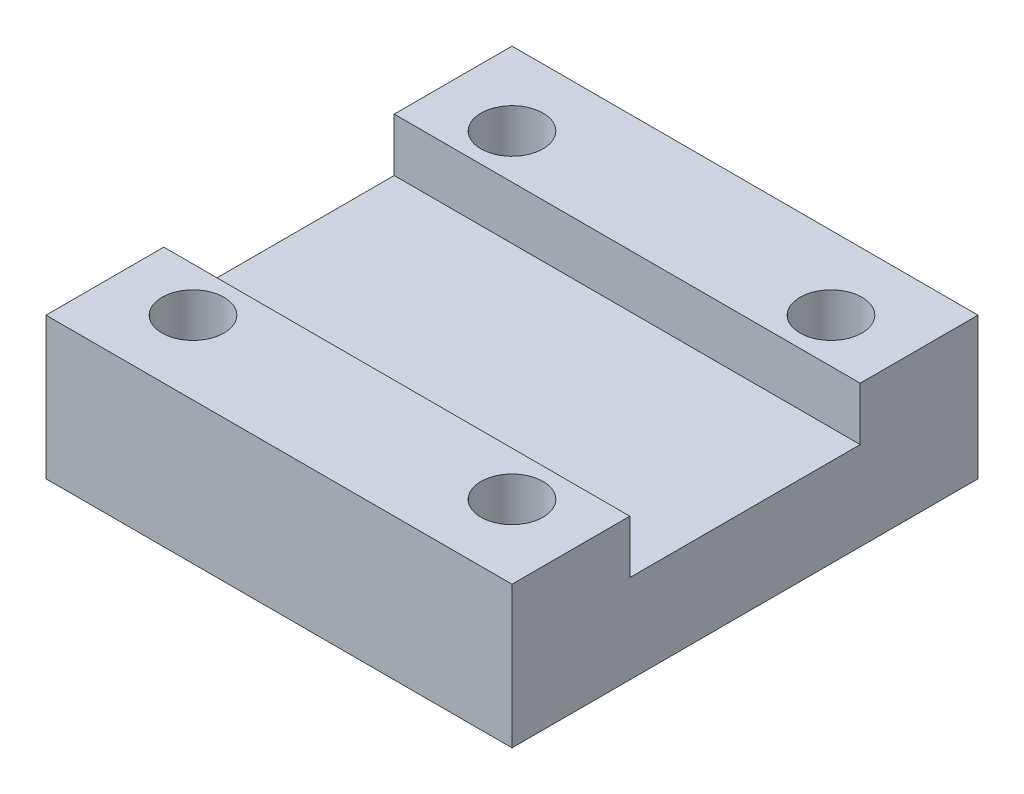
ISO-10303-21;
HEADER;
FILE_DESCRIPTION(('STEP AP214'),'2;1');
FILE_NAME('part.step','',(''),(''),'','','');
FILE_SCHEMA(('AUTOMOTIVE_DESIGN { 1 0 10303 214 1 1 1 1 }'));
ENDSEC;
DATA;
#1=APPLICATION_CONTEXT('core data for automotive mechanical design processes');
#2=APPLICATION_PROTOCOL_DEFINITION('international standard','automotive_design',2000,#1);
#3=PRODUCT_CONTEXT('',#1,'mechanical');
#4=PRODUCT('Part','Part','',(#3));
#5=PRODUCT_RELATED_PRODUCT_CATEGORY('part','',(#4));
#6=PRODUCT_DEFINITION_FORMATION('','',#4);
#7=PRODUCT_DEFINITION_CONTEXT('part definition',#1,'design');
#8=PRODUCT_DEFINITION('design','',#6,#7);
#9=PRODUCT_DEFINITION_SHAPE('','',#8);
#10=(LENGTH_UNIT() NAMED_UNIT(*) SI_UNIT(.MILLI.,.METRE.));
#11=(NAMED_UNIT(*) PLANE_ANGLE_UNIT() SI_UNIT($,.RADIAN.));
#12=(NAMED_UNIT(*) SI_UNIT($,.STERADIAN.) SOLID_ANGLE_UNIT());
#13=UNCERTAINTY_MEASURE_WITH_UNIT(LENGTH_MEASURE(1.E-05),#10,'distance_accuracy_value','');
#14=(GEOMETRIC_REPRESENTATION_CONTEXT(3) GLOBAL_UNCERTAINTY_ASSIGNED_CONTEXT((#13)) GLOBAL_UNIT_ASSIGNED_CONTEXT((#10,
#11,#12)) REPRESENTATION_CONTEXT('',''));
#15=CARTESIAN_POINT('',(0.,0.,0.));
#16=DIRECTION('',(0.,0.,1.));
#17=DIRECTION('',(1.,0.,0.));
#18=AXIS2_PLACEMENT_3D('',#15,#16,#17);
#19=CARTESIAN_POINT('',(0.,16.,0.));
#20=DIRECTION('',(0.,-1.,0.));
#21=DIRECTION('',(0.,0.,-1.));
#22=AXIS2_PLACEMENT_3D('',#19,#20,#21);
#23=PLANE('',#22);
#24=CARTESIAN_POINT('',(18.,16.,18.));
#25=DIRECTION('',(0.,1.,0.));
#26=DIRECTION('',(0.,0.,1.));
#27=AXIS2_PLACEMENT_3D('',#24,#25,#26);
#28=CIRCLE('',#27,3.5);
#29=CARTESIAN_POINT('',(18.,16.,21.5));
#30=VERTEX_POINT('',#29);
#31=EDGE_CURVE('E226',#30,#30,#28,.T.);
#32=ORIENTED_EDGE('',*,*,#31,.F.);
#33=EDGE_LOOP('',(#32));
#34=FACE_BOUND('',#33,.T.);
#35=CARTESIAN_POINT('',(-18.,16.,18.));
#36=DIRECTION('',(0.,1.,0.));
#37=DIRECTION('',(0.,0.,1.));
#38=AXIS2_PLACEMENT_3D('',#35,#36,#37);
#39=CIRCLE('',#38,3.5);
#40=CARTESIAN_POINT('',(-18.,16.,21.5));
#41=VERTEX_POINT('',#40);
#42=EDGE_CURVE('E222',#41,#41,#39,.T.);
#43=ORIENTED_EDGE('',*,*,#42,.F.);
#44=EDGE_LOOP('',(#43));
#45=FACE_BOUND('',#44,.T.);
#46=DIRECTION('',(0.,0.,-1.));
#47=VECTOR('',#46,1.);
#48=CARTESIAN_POINT('',(26.295,16.,26.295));
#49=LINE('',#48,#47);
#50=CARTESIAN_POINT('',(26.295,16.,26.295));
#51=VERTEX_POINT('',#50);
#52=CARTESIAN_POINT('',(26.295,16.,13.));
#53=VERTEX_POINT('',#52);
#54=EDGE_CURVE('E148',#51,#53,#49,.T.);
#55=ORIENTED_EDGE('',*,*,#54,.T.);
#56=DIRECTION('',(1.,0.,0.));
#57=VECTOR('',#56,1.);
#58=CARTESIAN_POINT('',(-26.295,16.,13.));
#59=LINE('',#58,#57);
#60=CARTESIAN_POINT('',(-26.295,16.,13.));
#61=VERTEX_POINT('',#60);
#62=EDGE_CURVE('E142',#61,#53,#59,.T.);
#63=ORIENTED_EDGE('',*,*,#62,.F.);
#64=DIRECTION('',(0.,0.,1.));
#65=VECTOR('',#64,1.);
#66=CARTESIAN_POINT('',(-26.295,16.,26.295));
#67=LINE('',#66,#65);
#68=CARTESIAN_POINT('',(-26.295,16.,26.295));
#69=VERTEX_POINT('',#68);
#70=EDGE_CURVE('E130',#61,#69,#67,.T.);
#71=ORIENTED_EDGE('',*,*,#70,.T.);
#72=DIRECTION('',(1.,0.,0.));
#73=VECTOR('',#72,1.);
#74=CARTESIAN_POINT('',(-26.295,16.,26.295));
#75=LINE('',#74,#73);
#76=EDGE_CURVE('E56',#69,#51,#75,.T.);
#77=ORIENTED_EDGE('',*,*,#76,.T.);
#78=EDGE_LOOP('',(#55,#63,#71,#77));
#79=FACE_BOUND('',#78,.T.);
#80=ADVANCED_FACE('F32',(#34,#45,#79),#23,.F.);
#81=CARTESIAN_POINT('',(26.295,16.,26.295));
#82=DIRECTION('',(-1.,0.,0.));
#83=DIRECTION('',(0.,0.,1.));
#84=AXIS2_PLACEMENT_3D('',#81,#82,#83);
#85=PLANE('',#84);
#86=DIRECTION('',(0.,0.,-1.));
#87=VECTOR('',#86,1.);
#88=CARTESIAN_POINT('',(26.295,10.,13.));
#89=LINE('',#88,#87);
#90=CARTESIAN_POINT('',(26.295,10.,13.));
#91=VERTEX_POINT('',#90);
#92=CARTESIAN_POINT('',(26.295,10.,-13.));
#93=VERTEX_POINT('',#92);
#94=EDGE_CURVE('E132',#91,#93,#89,.T.);
#95=ORIENTED_EDGE('',*,*,#94,.F.);
#96=DIRECTION('',(0.,-1.,0.));
#97=VECTOR('',#96,1.);
#98=CARTESIAN_POINT('',(26.295,16.,13.));
#99=LINE('',#98,#97);
#100=EDGE_CURVE('E113',#53,#91,#99,.T.);
#101=ORIENTED_EDGE('',*,*,#100,.F.);
#102=ORIENTED_EDGE('',*,*,#54,.F.);
#103=DIRECTION('',(0.,-1.,0.));
#104=VECTOR('',#103,1.);
#105=CARTESIAN_POINT('',(26.295,16.,26.295));
#106=LINE('',#105,#104);
#107=CARTESIAN_POINT('',(26.295,0.,26.295));
#108=VERTEX_POINT('',#107);
#109=EDGE_CURVE('E156',#51,#108,#106,.T.);
#110=ORIENTED_EDGE('',*,*,#109,.T.);
#111=DIRECTION('',(0.,0.,-1.));
#112=VECTOR('',#111,1.);
#113=CARTESIAN_POINT('',(26.295,0.,26.295));
#114=LINE('',#113,#112);
#115=CARTESIAN_POINT('',(26.295,0.,-26.295));
#116=VERTEX_POINT('',#115);
#117=EDGE_CURVE('E144',#108,#116,#114,.T.);
#118=ORIENTED_EDGE('',*,*,#117,.T.);
#119=DIRECTION('',(0.,-1.,0.));
#120=VECTOR('',#119,1.);
#121=CARTESIAN_POINT('',(26.295,16.,-26.295));
#122=LINE('',#121,#120);
#123=CARTESIAN_POINT('',(26.295,16.,-26.295));
#124=VERTEX_POINT('',#123);
#125=EDGE_CURVE('E11',#124,#116,#122,.T.);
#126=ORIENTED_EDGE('',*,*,#125,.F.);
#127=CARTESIAN_POINT('',(26.295,16.,-13.));
#128=VERTEX_POINT('',#127);
#129=EDGE_CURVE('E84',#128,#124,#49,.T.);
#130=ORIENTED_EDGE('',*,*,#129,.F.);
#131=DIRECTION('',(0.,1.,0.));
#132=VECTOR('',#131,1.);
#133=CARTESIAN_POINT('',(26.295,16.,-13.));
#134=LINE('',#133,#132);
#135=EDGE_CURVE('E47',#93,#128,#134,.T.);
#136=ORIENTED_EDGE('',*,*,#135,.F.);
#137=EDGE_LOOP('',(#95,#101,#102,#110,#118,#126,#130,#136));
#138=FACE_BOUND('',#137,.T.);
#139=ADVANCED_FACE('F34',(#138),#85,.F.);
#140=CARTESIAN_POINT('',(-26.295,16.,-26.295));
#141=DIRECTION('',(0.,0.,1.));
#142=DIRECTION('',(1.,0.,0.));
#143=AXIS2_PLACEMENT_3D('',#140,#141,#142);
#144=PLANE('',#143);
#145=DIRECTION('',(-1.,0.,0.));
#146=VECTOR('',#145,1.);
#147=CARTESIAN_POINT('',(-26.295,0.,-26.295));
#148=LINE('',#147,#146);
#149=CARTESIAN_POINT('',(-26.295,0.,-26.295));
#150=VERTEX_POINT('',#149);
#151=EDGE_CURVE('E159',#116,#150,#148,.T.);
#152=ORIENTED_EDGE('',*,*,#151,.T.);
#153=DIRECTION('',(0.,-1.,0.));
#154=VECTOR('',#153,1.);
#155=CARTESIAN_POINT('',(-26.295,16.,-26.295));
#156=LINE('',#155,#154);
#157=CARTESIAN_POINT('',(-26.295,16.,-26.295));
#158=VERTEX_POINT('',#157);
#159=EDGE_CURVE('E40',#158,#150,#156,.T.);
#160=ORIENTED_EDGE('',*,*,#159,.F.);
#161=DIRECTION('',(-1.,0.,0.));
#162=VECTOR('',#161,1.);
#163=CARTESIAN_POINT('',(-26.295,16.,-26.295));
#164=LINE('',#163,#162);
#165=EDGE_CURVE('E150',#124,#158,#164,.T.);
#166=ORIENTED_EDGE('',*,*,#165,.F.);
#167=ORIENTED_EDGE('',*,*,#125,.T.);
#168=EDGE_LOOP('',(#152,#160,#166,#167));
#169=FACE_BOUND('',#168,.T.);
#170=ADVANCED_FACE('F187',(#169),#144,.F.);
#171=CARTESIAN_POINT('',(-26.295,16.,26.295));
#172=DIRECTION('',(1.,0.,0.));
#173=DIRECTION('',(0.,0.,-1.));
#174=AXIS2_PLACEMENT_3D('',#171,#172,#173);
#175=PLANE('',#174);
#176=ORIENTED_EDGE('',*,*,#70,.F.);
#177=DIRECTION('',(0.,-1.,0.));
#178=VECTOR('',#177,1.);
#179=CARTESIAN_POINT('',(-26.295,16.,13.));
#180=LINE('',#179,#178);
#181=CARTESIAN_POINT('',(-26.295,10.,13.));
#182=VERTEX_POINT('',#181);
#183=EDGE_CURVE('E110',#61,#182,#180,.T.);
#184=ORIENTED_EDGE('',*,*,#183,.T.);
#185=DIRECTION('',(0.,0.,-1.));
#186=VECTOR('',#185,1.);
#187=CARTESIAN_POINT('',(-26.295,10.,13.));
#188=LINE('',#187,#186);
#189=CARTESIAN_POINT('',(-26.295,10.,-13.));
#190=VERTEX_POINT('',#189);
#191=EDGE_CURVE('E121',#182,#190,#188,.T.);
#192=ORIENTED_EDGE('',*,*,#191,.T.);
#193=DIRECTION('',(0.,1.,0.));
#194=VECTOR('',#193,1.);
#195=CARTESIAN_POINT('',(-26.295,16.,-13.));
#196=LINE('',#195,#194);
#197=CARTESIAN_POINT('',(-26.295,16.,-13.));
#198=VERTEX_POINT('',#197);
#199=EDGE_CURVE('E118',#190,#198,#196,.T.);
#200=ORIENTED_EDGE('',*,*,#199,.T.);
#201=EDGE_CURVE('E152',#158,#198,#67,.T.);
#202=ORIENTED_EDGE('',*,*,#201,.F.);
#203=ORIENTED_EDGE('',*,*,#159,.T.);
#204=DIRECTION('',(0.,0.,1.));
#205=VECTOR('',#204,1.);
#206=CARTESIAN_POINT('',(-26.295,0.,26.295));
#207=LINE('',#206,#205);
#208=CARTESIAN_POINT('',(-26.295,0.,26.295));
#209=VERTEX_POINT('',#208);
#210=EDGE_CURVE('E161',#150,#209,#207,.T.);
#211=ORIENTED_EDGE('',*,*,#210,.T.);
#212=DIRECTION('',(0.,-1.,0.));
#213=VECTOR('',#212,1.);
#214=CARTESIAN_POINT('',(-26.295,16.,26.295));
#215=LINE('',#214,#213);
#216=EDGE_CURVE('E165',#69,#209,#215,.T.);
#217=ORIENTED_EDGE('',*,*,#216,.F.);
#218=EDGE_LOOP('',(#176,#184,#192,#200,#202,#203,#211,#217));
#219=FACE_BOUND('',#218,.T.);
#220=ADVANCED_FACE('F128',(#219),#175,.F.);
#221=CARTESIAN_POINT('',(-26.295,16.,26.295));
#222=DIRECTION('',(0.,0.,-1.));
#223=DIRECTION('',(-1.,0.,0.));
#224=AXIS2_PLACEMENT_3D('',#221,#222,#223);
#225=PLANE('',#224);
#226=DIRECTION('',(1.,0.,0.));
#227=VECTOR('',#226,1.);
#228=CARTESIAN_POINT('',(-26.295,0.,26.295));
#229=LINE('',#228,#227);
#230=EDGE_CURVE('E77',#209,#108,#229,.T.);
#231=ORIENTED_EDGE('',*,*,#230,.T.);
#232=ORIENTED_EDGE('',*,*,#109,.F.);
#233=ORIENTED_EDGE('',*,*,#76,.F.);
#234=ORIENTED_EDGE('',*,*,#216,.T.);
#235=EDGE_LOOP('',(#231,#232,#233,#234));
#236=FACE_BOUND('',#235,.T.);
#237=ADVANCED_FACE('F177',(#236),#225,.F.);
#238=CARTESIAN_POINT('',(18.,16.,-18.));
#239=DIRECTION('',(0.,1.,0.));
#240=DIRECTION('',(0.,0.,1.));
#241=AXIS2_PLACEMENT_3D('',#238,#239,#240);
#242=CIRCLE('',#241,3.5);
#243=CARTESIAN_POINT('',(18.,16.,-14.5));
#244=VERTEX_POINT('',#243);
#245=EDGE_CURVE('E230',#244,#244,#242,.T.);
#246=ORIENTED_EDGE('',*,*,#245,.F.);
#247=EDGE_LOOP('',(#246));
#248=FACE_BOUND('',#247,.T.);
#249=CARTESIAN_POINT('',(-18.,16.,-18.));
#250=DIRECTION('',(0.,1.,0.));
#251=DIRECTION('',(0.,0.,1.));
#252=AXIS2_PLACEMENT_3D('',#249,#250,#251);
#253=CIRCLE('',#252,3.5);
#254=CARTESIAN_POINT('',(-18.,16.,-14.5));
#255=VERTEX_POINT('',#254);
#256=EDGE_CURVE('E135',#255,#255,#253,.T.);
#257=ORIENTED_EDGE('',*,*,#256,.F.);
#258=EDGE_LOOP('',(#257));
#259=FACE_BOUND('',#258,.T.);
#260=ORIENTED_EDGE('',*,*,#201,.T.);
#261=DIRECTION('',(1.,0.,0.));
#262=VECTOR('',#261,1.);
#263=CARTESIAN_POINT('',(-26.295,16.,-13.));
#264=LINE('',#263,#262);
#265=EDGE_CURVE('E145',#198,#128,#264,.T.);
#266=ORIENTED_EDGE('',*,*,#265,.T.);
#267=ORIENTED_EDGE('',*,*,#129,.T.);
#268=ORIENTED_EDGE('',*,*,#165,.T.);
#269=EDGE_LOOP('',(#260,#266,#267,#268));
#270=FACE_BOUND('',#269,.T.);
#271=ADVANCED_FACE('F179',(#248,#259,#270),#23,.F.);
#272=CARTESIAN_POINT('',(0.,0.,0.));
#273=DIRECTION('',(0.,-1.,0.));
#274=DIRECTION('',(0.,0.,-1.));
#275=AXIS2_PLACEMENT_3D('',#272,#273,#274);
#276=PLANE('',#275);
#277=CARTESIAN_POINT('',(18.,0.,-18.));
#278=DIRECTION('',(0.,1.,0.));
#279=DIRECTION('',(0.,0.,1.));
#280=AXIS2_PLACEMENT_3D('',#277,#278,#279);
#281=CIRCLE('',#280,3.5);
#282=CARTESIAN_POINT('',(18.,0.,-14.5));
#283=VERTEX_POINT('',#282);
#284=EDGE_CURVE('E208',#283,#283,#281,.T.);
#285=ORIENTED_EDGE('',*,*,#284,.T.);
#286=EDGE_LOOP('',(#285));
#287=FACE_BOUND('',#286,.T.);
#288=CARTESIAN_POINT('',(18.,0.,18.));
#289=DIRECTION('',(0.,1.,0.));
#290=DIRECTION('',(0.,0.,1.));
#291=AXIS2_PLACEMENT_3D('',#288,#289,#290);
#292=CIRCLE('',#291,3.5);
#293=CARTESIAN_POINT('',(18.,0.,21.5));
#294=VERTEX_POINT('',#293);
#295=EDGE_CURVE('E212',#294,#294,#292,.T.);
#296=ORIENTED_EDGE('',*,*,#295,.T.);
#297=EDGE_LOOP('',(#296));
#298=FACE_BOUND('',#297,.T.);
#299=CARTESIAN_POINT('',(-18.,0.,18.));
#300=DIRECTION('',(0.,1.,0.));
#301=DIRECTION('',(0.,0.,1.));
#302=AXIS2_PLACEMENT_3D('',#299,#300,#301);
#303=CIRCLE('',#302,3.5);
#304=CARTESIAN_POINT('',(-18.,0.,21.5));
#305=VERTEX_POINT('',#304);
#306=EDGE_CURVE('E216',#305,#305,#303,.T.);
#307=ORIENTED_EDGE('',*,*,#306,.T.);
#308=EDGE_LOOP('',(#307));
#309=FACE_BOUND('',#308,.T.);
#310=CARTESIAN_POINT('',(-18.,0.,-18.));
#311=DIRECTION('',(0.,1.,0.));
#312=DIRECTION('',(0.,0.,1.));
#313=AXIS2_PLACEMENT_3D('',#310,#311,#312);
#314=CIRCLE('',#313,3.5);
#315=CARTESIAN_POINT('',(-18.,0.,-14.5));
#316=VERTEX_POINT('',#315);
#317=EDGE_CURVE('E140',#316,#316,#314,.T.);
#318=ORIENTED_EDGE('',*,*,#317,.T.);
#319=EDGE_LOOP('',(#318));
#320=FACE_BOUND('',#319,.T.);
#321=ORIENTED_EDGE('',*,*,#117,.F.);
#322=ORIENTED_EDGE('',*,*,#230,.F.);
#323=ORIENTED_EDGE('',*,*,#210,.F.);
#324=ORIENTED_EDGE('',*,*,#151,.F.);
#325=EDGE_LOOP('',(#321,#322,#323,#324));
#326=FACE_BOUND('',#325,.T.);
#327=ADVANCED_FACE('F173',(#287,#298,#309,#320,#326),#276,.T.);
#328=CARTESIAN_POINT('',(-26.295,16.,13.));
#329=DIRECTION('',(0.,0.,1.));
#330=DIRECTION('',(1.,0.,0.));
#331=AXIS2_PLACEMENT_3D('',#328,#329,#330);
#332=PLANE('',#331);
#333=ORIENTED_EDGE('',*,*,#100,.T.);
#334=DIRECTION('',(1.,0.,0.));
#335=VECTOR('',#334,1.);
#336=CARTESIAN_POINT('',(-26.295,10.,13.));
#337=LINE('',#336,#335);
#338=EDGE_CURVE('E106',#182,#91,#337,.T.);
#339=ORIENTED_EDGE('',*,*,#338,.F.);
#340=ORIENTED_EDGE('',*,*,#183,.F.);
#341=ORIENTED_EDGE('',*,*,#62,.T.);
#342=EDGE_LOOP('',(#333,#339,#340,#341));
#343=FACE_BOUND('',#342,.T.);
#344=ADVANCED_FACE('F108',(#343),#332,.F.);
#345=CARTESIAN_POINT('',(-26.295,16.,-13.));
#346=DIRECTION('',(0.,0.,-1.));
#347=DIRECTION('',(0.,1.,0.));
#348=AXIS2_PLACEMENT_3D('',#345,#346,#347);
#349=PLANE('',#348);
#350=ORIENTED_EDGE('',*,*,#135,.T.);
#351=ORIENTED_EDGE('',*,*,#265,.F.);
#352=ORIENTED_EDGE('',*,*,#199,.F.);
#353=DIRECTION('',(1.,0.,0.));
#354=VECTOR('',#353,1.);
#355=CARTESIAN_POINT('',(-26.295,10.,-13.));
#356=LINE('',#355,#354);
#357=EDGE_CURVE('E117',#190,#93,#356,.T.);
#358=ORIENTED_EDGE('',*,*,#357,.T.);
#359=EDGE_LOOP('',(#350,#351,#352,#358));
#360=FACE_BOUND('',#359,.T.);
#361=ADVANCED_FACE('F204',(#360),#349,.F.);
#362=CARTESIAN_POINT('',(-26.295,10.,13.));
#363=DIRECTION('',(0.,-1.,0.));
#364=DIRECTION('',(0.,0.,-1.));
#365=AXIS2_PLACEMENT_3D('',#362,#363,#364);
#366=PLANE('',#365);
#367=ORIENTED_EDGE('',*,*,#94,.T.);
#368=ORIENTED_EDGE('',*,*,#357,.F.);
#369=ORIENTED_EDGE('',*,*,#191,.F.);
#370=ORIENTED_EDGE('',*,*,#338,.T.);
#371=EDGE_LOOP('',(#367,#368,#369,#370));
#372=FACE_BOUND('',#371,.T.);
#373=ADVANCED_FACE('F122',(#372),#366,.F.);
#374=CARTESIAN_POINT('',(-18.,0.,-18.));
#375=DIRECTION('',(0.,1.,0.));
#376=DIRECTION('',(0.,0.,1.));
#377=AXIS2_PLACEMENT_3D('',#374,#375,#376);
#378=CYLINDRICAL_SURFACE('',#377,3.5);
#379=ORIENTED_EDGE('',*,*,#317,.F.);
#380=EDGE_LOOP('',(#379));
#381=FACE_BOUND('',#380,.T.);
#382=ORIENTED_EDGE('',*,*,#256,.T.);
#383=EDGE_LOOP('',(#382));
#384=FACE_BOUND('',#383,.T.);
#385=ADVANCED_FACE('F273',(#381,#384),#378,.F.);
#386=CARTESIAN_POINT('',(-18.,0.,18.));
#387=DIRECTION('',(0.,1.,0.));
#388=DIRECTION('',(0.,0.,1.));
#389=AXIS2_PLACEMENT_3D('',#386,#387,#388);
#390=CYLINDRICAL_SURFACE('',#389,3.5);
#391=ORIENTED_EDGE('',*,*,#306,.F.);
#392=EDGE_LOOP('',(#391));
#393=FACE_BOUND('',#392,.T.);
#394=ORIENTED_EDGE('',*,*,#42,.T.);
#395=EDGE_LOOP('',(#394));
#396=FACE_BOUND('',#395,.T.);
#397=ADVANCED_FACE('F295',(#393,#396),#390,.F.);
#398=CARTESIAN_POINT('',(18.,0.,18.));
#399=DIRECTION('',(0.,1.,0.));
#400=DIRECTION('',(0.,0.,1.));
#401=AXIS2_PLACEMENT_3D('',#398,#399,#400);
#402=CYLINDRICAL_SURFACE('',#401,3.5);
#403=ORIENTED_EDGE('',*,*,#295,.F.);
#404=EDGE_LOOP('',(#403));
#405=FACE_BOUND('',#404,.T.);
#406=ORIENTED_EDGE('',*,*,#31,.T.);
#407=EDGE_LOOP('',(#406));
#408=FACE_BOUND('',#407,.T.);
#409=ADVANCED_FACE('F304',(#405,#408),#402,.F.);
#410=CARTESIAN_POINT('',(18.,0.,-18.));
#411=DIRECTION('',(0.,1.,0.));
#412=DIRECTION('',(0.,0.,1.));
#413=AXIS2_PLACEMENT_3D('',#410,#411,#412);
#414=CYLINDRICAL_SURFACE('',#413,3.5);
#415=ORIENTED_EDGE('',*,*,#284,.F.);
#416=EDGE_LOOP('',(#415));
#417=FACE_BOUND('',#416,.T.);
#418=ORIENTED_EDGE('',*,*,#245,.T.);
#419=EDGE_LOOP('',(#418));
#420=FACE_BOUND('',#419,.T.);
#421=ADVANCED_FACE('F235',(#417,#420),#414,.F.);
#422=CLOSED_SHELL('',(#80,#139,#170,#220,#237,#271,#327,#344,#361,#373,#385,#397,#409,#421));
#423=MANIFOLD_SOLID_BREP('B2',#422);
#424=ADVANCED_BREP_SHAPE_REPRESENTATION('',(#18,#423),#14);
#425=SHAPE_DEFINITION_REPRESENTATION(#9,#424);
ENDSEC;
END-ISO-10303-21;
